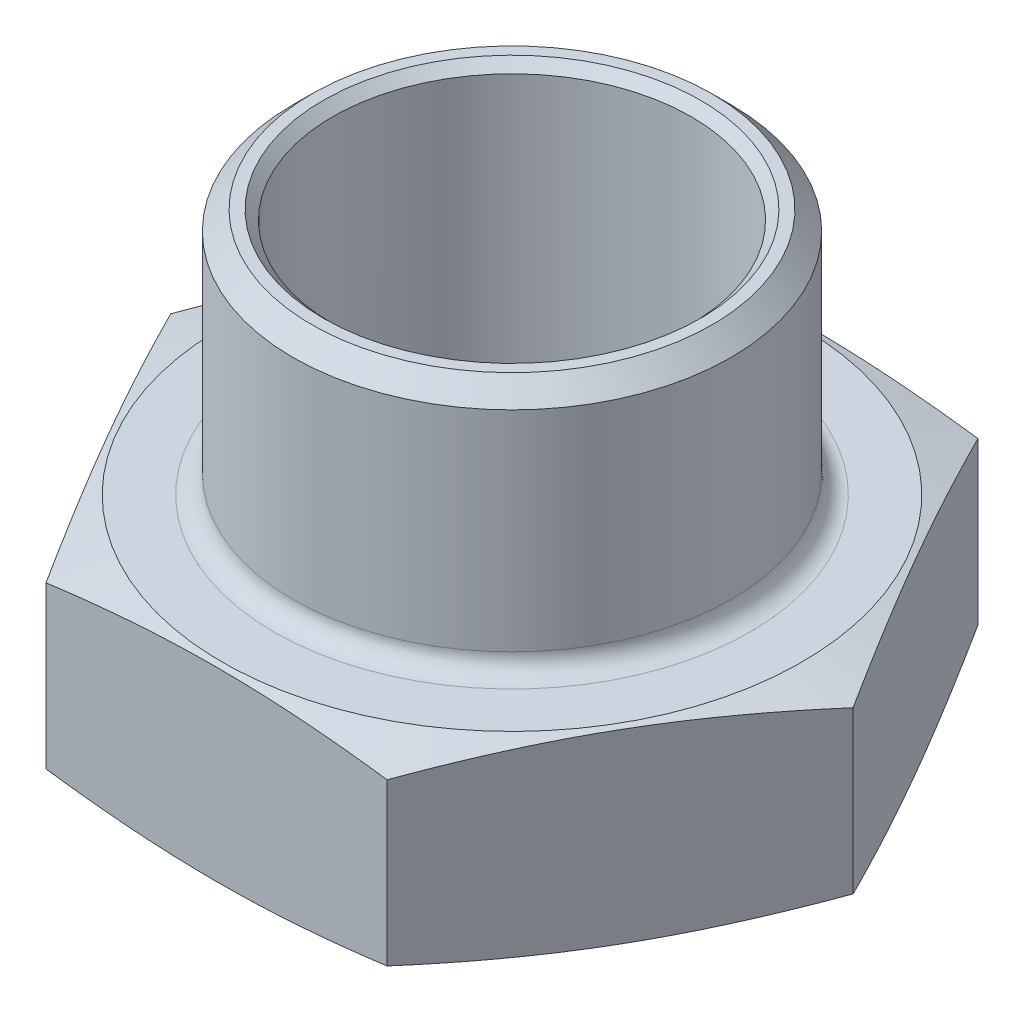
ISO-10303-21;
HEADER;
FILE_DESCRIPTION(('STEP AP214'),'2;1');
FILE_NAME('part.step','',(''),(''),'','','');
FILE_SCHEMA(('AUTOMOTIVE_DESIGN { 1 0 10303 214 1 1 1 1 }'));
ENDSEC;
DATA;
#1=APPLICATION_CONTEXT('core data for automotive mechanical design processes');
#2=APPLICATION_PROTOCOL_DEFINITION('international standard','automotive_design',2000,#1);
#3=PRODUCT_CONTEXT('',#1,'mechanical');
#4=PRODUCT('Part','Part','',(#3));
#5=PRODUCT_RELATED_PRODUCT_CATEGORY('part','',(#4));
#6=PRODUCT_DEFINITION_FORMATION('','',#4);
#7=PRODUCT_DEFINITION_CONTEXT('part definition',#1,'design');
#8=PRODUCT_DEFINITION('design','',#6,#7);
#9=PRODUCT_DEFINITION_SHAPE('','',#8);
#10=(LENGTH_UNIT() NAMED_UNIT(*) SI_UNIT(.MILLI.,.METRE.));
#11=(NAMED_UNIT(*) PLANE_ANGLE_UNIT() SI_UNIT($,.RADIAN.));
#12=(NAMED_UNIT(*) SI_UNIT($,.STERADIAN.) SOLID_ANGLE_UNIT());
#13=UNCERTAINTY_MEASURE_WITH_UNIT(LENGTH_MEASURE(1.E-05),#10,'distance_accuracy_value','');
#14=(GEOMETRIC_REPRESENTATION_CONTEXT(3) GLOBAL_UNCERTAINTY_ASSIGNED_CONTEXT((#13)) GLOBAL_UNIT_ASSIGNED_CONTEXT((#10,
#11,#12)) REPRESENTATION_CONTEXT('',''));
#15=CARTESIAN_POINT('',(0.,0.,0.));
#16=DIRECTION('',(0.,0.,1.));
#17=DIRECTION('',(1.,0.,0.));
#18=AXIS2_PLACEMENT_3D('',#15,#16,#17);
#19=CARTESIAN_POINT('',(43.6928822439766,28.4904169415951,36.0751899994845));
#20=DIRECTION('',(0.,1.,0.));
#21=DIRECTION('',(1.,0.,0.));
#22=AXIS2_PLACEMENT_3D('',#19,#20,#21);
#23=PLANE('',#22);
#24=CARTESIAN_POINT('',(47.9816722439766,28.4904169415951,31.7863999994844));
#25=DIRECTION('',(0.,1.,0.));
#26=DIRECTION('',(0.,0.,1.));
#27=AXIS2_PLACEMENT_3D('',#24,#25,#26);
#28=CIRCLE('',#27,3.2004);
#29=CARTESIAN_POINT('',(47.9816722439766,28.4904169415951,34.9867999994844));
#30=VERTEX_POINT('',#29);
#31=EDGE_CURVE('E38',#30,#30,#28,.T.);
#32=ORIENTED_EDGE('',*,*,#31,.F.);
#33=EDGE_LOOP('',(#32));
#34=FACE_BOUND('',#33,.T.);
#35=CARTESIAN_POINT('',(47.9816722439766,28.4904169415951,31.7863999994844));
#36=DIRECTION('',(0.,-1.,0.));
#37=DIRECTION('',(0.,0.,-1.));
#38=AXIS2_PLACEMENT_3D('',#35,#36,#37);
#39=CIRCLE('',#38,3.89889999999996);
#40=CARTESIAN_POINT('',(47.9816722439766,28.4904169415951,27.8874999994845));
#41=VERTEX_POINT('',#40);
#42=EDGE_CURVE('E279',#41,#41,#39,.T.);
#43=ORIENTED_EDGE('',*,*,#42,.F.);
#44=EDGE_LOOP('',(#43));
#45=FACE_BOUND('',#44,.T.);
#46=ADVANCED_FACE('F34',(#34,#45),#23,.T.);
#47=CARTESIAN_POINT('',(47.9816722439766,28.7444169415951,31.7863999994844));
#48=DIRECTION('',(0.,1.,0.));
#49=DIRECTION('',(0.,0.,1.));
#50=AXIS2_PLACEMENT_3D('',#47,#48,#49);
#51=TOROIDAL_SURFACE('',#50,3.20040000000002,0.254000000000013);
#52=CARTESIAN_POINT('',(47.9816722439766,28.7444169415951,31.7863999994844));
#53=DIRECTION('',(0.,1.,0.));
#54=DIRECTION('',(0.,0.,1.));
#55=AXIS2_PLACEMENT_3D('',#52,#53,#54);
#56=CIRCLE('',#55,2.9464);
#57=CARTESIAN_POINT('',(47.9816722439766,28.7444169415951,34.7327999994844));
#58=VERTEX_POINT('',#57);
#59=EDGE_CURVE('E105',#58,#58,#56,.T.);
#60=ORIENTED_EDGE('',*,*,#59,.F.);
#61=EDGE_LOOP('',(#60));
#62=FACE_BOUND('',#61,.T.);
#63=ORIENTED_EDGE('',*,*,#31,.T.);
#64=EDGE_LOOP('',(#63));
#65=FACE_BOUND('',#64,.T.);
#66=ADVANCED_FACE('F217',(#62,#65),#51,.F.);
#67=CARTESIAN_POINT('',(47.9816722439766,28.3052238277421,31.7863999994844));
#68=DIRECTION('',(0.,-1.,0.));
#69=DIRECTION('',(0.,0.,-1.));
#70=AXIS2_PLACEMENT_3D('',#67,#68,#69);
#71=CONICAL_SURFACE('',#70,4.59005011011132,1.30899693899576);
#72=ORIENTED_EDGE('',*,*,#42,.T.);
#73=EDGE_LOOP('',(#72));
#74=FACE_BOUND('',#73,.T.);
#75=CARTESIAN_POINT('',(45.6866471889209,28.3052238277421,27.8112999994845));
#76=CARTESIAN_POINT('',(45.591340552349,28.3307708291069,27.9763759363255));
#77=CARTESIAN_POINT('',(45.4958611245068,28.3539632130251,28.1417511564258));
#78=CARTESIAN_POINT('',(45.3045651064509,28.3947099623288,28.4730855789842));
#79=CARTESIAN_POINT('',(45.2087483952374,28.4122620381154,28.6390449910202));
#80=CARTESIAN_POINT('',(45.0173586926233,28.4407035763412,28.9705416799932));
#81=CARTESIAN_POINT('',(44.9217869951443,28.4516269534729,29.1360767157926));
#82=CARTESIAN_POINT('',(44.7305217341354,28.4662740755286,29.4673578655829));
#83=CARTESIAN_POINT('',(44.6348281977642,28.4699992131318,29.6331039325337));
#84=CARTESIAN_POINT('',(44.4434411250219,28.4699992131318,29.9645960664353));
#85=CARTESIAN_POINT('',(44.3477475886507,28.4662740755286,30.1303421333861));
#86=CARTESIAN_POINT('',(44.1564823276419,28.4516269534729,30.4616232831763));
#87=CARTESIAN_POINT('',(44.0609106301628,28.4407035763412,30.6271583189757));
#88=CARTESIAN_POINT('',(43.8695209275487,28.4122620381154,30.9586550079487));
#89=CARTESIAN_POINT('',(43.7737042163352,28.3947099623288,31.1246144199847));
#90=CARTESIAN_POINT('',(43.5824081982794,28.3539632130251,31.4559488425431));
#91=CARTESIAN_POINT('',(43.4869287704372,28.3307708291069,31.6213240626434));
#92=CARTESIAN_POINT('',(43.3916221338652,28.3052238277421,31.7863999994845));
#93=B_SPLINE_CURVE_WITH_KNOTS('',3,(#75,#76,#77,#78,#79,#80,#81,#82,#83,#84,#85,#86,#87,#88,#89,
#90,#91,#92),.UNSPECIFIED.,.F.,.F.,(4,2,2,2,2,2,2,2,4),(0.,0.576983100050313,1.15420012276933,
1.72843844362826,2.30256565261446,2.87669286160065,3.45093118245958,4.02814820517859,
4.60513130522891),.UNSPECIFIED.);
#94=CARTESIAN_POINT('',(45.6866471889209,28.3052238277421,27.8112999994845));
#95=VERTEX_POINT('',#94);
#96=CARTESIAN_POINT('',(43.3916221338652,28.3052238277421,31.7863999994844));
#97=VERTEX_POINT('',#96);
#98=EDGE_CURVE('E89',#95,#97,#93,.T.);
#99=ORIENTED_EDGE('',*,*,#98,.T.);
#100=CARTESIAN_POINT('',(43.3916221338652,28.3052238277421,31.7863999994844));
#101=CARTESIAN_POINT('',(43.4869287704372,28.3307708291069,31.9514759363255));
#102=CARTESIAN_POINT('',(43.5824081982794,28.3539632130251,32.1168511564258));
#103=CARTESIAN_POINT('',(43.7737042163352,28.3947099623288,32.4481855789842));
#104=CARTESIAN_POINT('',(43.8695209275488,28.4122620381154,32.6141449910202));
#105=CARTESIAN_POINT('',(44.0609106301628,28.4407035763412,32.9456416799932));
#106=CARTESIAN_POINT('',(44.1564823276419,28.4516269534729,33.1111767157926));
#107=CARTESIAN_POINT('',(44.3477475886507,28.4662740755286,33.4424578655828));
#108=CARTESIAN_POINT('',(44.4434411250219,28.4699992131318,33.6082039325336));
#109=CARTESIAN_POINT('',(44.6348281977642,28.4699992131318,33.9396960664353));
#110=CARTESIAN_POINT('',(44.7305217341354,28.4662740755286,34.1054421333861));
#111=CARTESIAN_POINT('',(44.9217869951443,28.4516269534729,34.4367232831763));
#112=CARTESIAN_POINT('',(45.0173586926233,28.4407035763412,34.6022583189757));
#113=CARTESIAN_POINT('',(45.2087483952374,28.4122620381154,34.9337550079487));
#114=CARTESIAN_POINT('',(45.3045651064509,28.3947099623288,35.0997144199847));
#115=CARTESIAN_POINT('',(45.4958611245068,28.3539632130251,35.4310488425431));
#116=CARTESIAN_POINT('',(45.591340552349,28.3307708291069,35.5964240626434));
#117=CARTESIAN_POINT('',(45.6866471889209,28.3052238277421,35.7614999994844));
#118=B_SPLINE_CURVE_WITH_KNOTS('',3,(#100,#101,#102,#103,#104,#105,#106,#107,#108,#109,#110,
#111,#112,#113,#114,#115,#116,#117),.UNSPECIFIED.,.F.,.F.,(4,2,2,2,2,2,2,2,4),(0.,
0.576983100050319,1.15420012276934,1.72843844362827,2.30256565261447,2.87669286160067,
3.45093118245959,4.02814820517861,4.60513130522892),.UNSPECIFIED.);
#119=CARTESIAN_POINT('',(45.6866471889209,28.3052238277421,35.7614999994844));
#120=VERTEX_POINT('',#119);
#121=EDGE_CURVE('E121',#97,#120,#118,.T.);
#122=ORIENTED_EDGE('',*,*,#121,.T.);
#123=CARTESIAN_POINT('',(45.6866471889209,28.3052238277421,35.7614999994844));
#124=CARTESIAN_POINT('',(45.8772604620647,28.3307708291069,35.7614999994844));
#125=CARTESIAN_POINT('',(46.0682193177492,28.3539632130251,35.7614999994844));
#126=CARTESIAN_POINT('',(46.4508113538609,28.3947099623288,35.7614999994844));
#127=CARTESIAN_POINT('',(46.6424447762879,28.4122620381154,35.7614999994844));
#128=CARTESIAN_POINT('',(47.025224181516,28.4407035763412,35.7614999994844));
#129=CARTESIAN_POINT('',(47.2163675764742,28.4516269534729,35.7614999994844));
#130=CARTESIAN_POINT('',(47.5988980984919,28.4662740755286,35.7614999994844));
#131=CARTESIAN_POINT('',(47.7902851712342,28.4699992131318,35.7614999994844));
#132=CARTESIAN_POINT('',(48.1730593167189,28.4699992131318,35.7614999994844));
#133=CARTESIAN_POINT('',(48.3644463894612,28.4662740755286,35.7614999994844));
#134=CARTESIAN_POINT('',(48.746976911479,28.4516269534729,35.7614999994844));
#135=CARTESIAN_POINT('',(48.9381203064371,28.4407035763412,35.7614999994844));
#136=CARTESIAN_POINT('',(49.3208997116652,28.4122620381154,35.7614999994844));
#137=CARTESIAN_POINT('',(49.5125331340922,28.3947099623288,35.7614999994844));
#138=CARTESIAN_POINT('',(49.895125170204,28.3539632130251,35.7614999994844));
#139=CARTESIAN_POINT('',(50.0860840258884,28.3307708291069,35.7614999994844));
#140=CARTESIAN_POINT('',(50.2766972990323,28.3052238277421,35.7614999994844));
#141=B_SPLINE_CURVE_WITH_KNOTS('',3,(#123,#124,#125,#126,#127,#128,#129,#130,#131,#132,#133,
#134,#135,#136,#137,#138,#139,#140),.UNSPECIFIED.,.F.,.F.,(4,2,2,2,2,2,2,2,4),(0.,
0.576983100050334,1.15420012276935,1.72843844362827,2.30256565261447,2.87669286160067,
3.4509311824596,4.02814820517861,4.60513130522893),.UNSPECIFIED.);
#142=CARTESIAN_POINT('',(50.2766972990323,28.3052238277421,35.7614999994844));
#143=VERTEX_POINT('',#142);
#144=EDGE_CURVE('E118',#120,#143,#141,.T.);
#145=ORIENTED_EDGE('',*,*,#144,.T.);
#146=CARTESIAN_POINT('',(50.2766972990323,28.3052238277421,35.7614999994844));
#147=CARTESIAN_POINT('',(50.3720039356042,28.3307708291069,35.5964240626434));
#148=CARTESIAN_POINT('',(50.4674833634464,28.3539632130251,35.4310488425431));
#149=CARTESIAN_POINT('',(50.6587793815023,28.3947099623288,35.0997144199847));
#150=CARTESIAN_POINT('',(50.7545960927158,28.4122620381154,34.9337550079487));
#151=CARTESIAN_POINT('',(50.9459857953298,28.4407035763412,34.6022583189757));
#152=CARTESIAN_POINT('',(51.0415574928089,28.4516269534729,34.4367232831763));
#153=CARTESIAN_POINT('',(51.2328227538178,28.4662740755286,34.105442133386));
#154=CARTESIAN_POINT('',(51.3285162901889,28.4699992131318,33.9396960664352));
#155=CARTESIAN_POINT('',(51.5199033629313,28.4699992131318,33.6082039325336));
#156=CARTESIAN_POINT('',(51.6155968993025,28.4662740755286,33.4424578655828));
#157=CARTESIAN_POINT('',(51.8068621603113,28.4516269534729,33.1111767157926));
#158=CARTESIAN_POINT('',(51.9024338577904,28.4407035763412,32.9456416799932));
#159=CARTESIAN_POINT('',(52.0938235604044,28.4122620381154,32.6141449910202));
#160=CARTESIAN_POINT('',(52.1896402716179,28.3947099623288,32.4481855789842));
#161=CARTESIAN_POINT('',(52.3809362896738,28.3539632130251,32.1168511564258));
#162=CARTESIAN_POINT('',(52.476415717516,28.3307708291069,31.9514759363255));
#163=CARTESIAN_POINT('',(52.571722354088,28.3052238277421,31.7863999994844));
#164=B_SPLINE_CURVE_WITH_KNOTS('',3,(#146,#147,#148,#149,#150,#151,#152,#153,#154,#155,#156,
#157,#158,#159,#160,#161,#162,#163),.UNSPECIFIED.,.F.,.F.,(4,2,2,2,2,2,2,2,4),(0.,
0.576983100050323,1.15420012276934,1.72843844362827,2.30256565261447,2.87669286160068,
3.4509311824596,4.02814820517862,4.60513130522893),.UNSPECIFIED.);
#165=CARTESIAN_POINT('',(52.571722354088,28.3052238277421,31.7863999994844));
#166=VERTEX_POINT('',#165);
#167=EDGE_CURVE('E115',#143,#166,#164,.T.);
#168=ORIENTED_EDGE('',*,*,#167,.T.);
#169=CARTESIAN_POINT('',(52.571722354088,28.3052238277421,31.7863999994844));
#170=CARTESIAN_POINT('',(52.476415717516,28.3307708291069,31.6213240626434));
#171=CARTESIAN_POINT('',(52.3809362896738,28.3539632130251,31.4559488425431));
#172=CARTESIAN_POINT('',(52.1896402716179,28.3947099623288,31.1246144199847));
#173=CARTESIAN_POINT('',(52.0938235604044,28.4122620381154,30.9586550079487));
#174=CARTESIAN_POINT('',(51.9024338577904,28.4407035763412,30.6271583189757));
#175=CARTESIAN_POINT('',(51.8068621603113,28.4516269534729,30.4616232831763));
#176=CARTESIAN_POINT('',(51.6155968993024,28.4662740755286,30.1303421333861));
#177=CARTESIAN_POINT('',(51.5199033629313,28.4699992131318,29.9645960664353));
#178=CARTESIAN_POINT('',(51.3285162901889,28.4699992131318,29.6331039325337));
#179=CARTESIAN_POINT('',(51.2328227538178,28.4662740755286,29.4673578655828));
#180=CARTESIAN_POINT('',(51.0415574928089,28.4516269534729,29.1360767157926));
#181=CARTESIAN_POINT('',(50.9459857953298,28.4407035763412,28.9705416799932));
#182=CARTESIAN_POINT('',(50.7545960927158,28.4122620381154,28.6390449910202));
#183=CARTESIAN_POINT('',(50.6587793815023,28.3947099623288,28.4730855789842));
#184=CARTESIAN_POINT('',(50.4674833634464,28.3539632130251,28.1417511564258));
#185=CARTESIAN_POINT('',(50.3720039356042,28.3307708291069,27.9763759363255));
#186=CARTESIAN_POINT('',(50.2766972990323,28.3052238277421,27.8112999994845));
#187=B_SPLINE_CURVE_WITH_KNOTS('',3,(#169,#170,#171,#172,#173,#174,#175,#176,#177,#178,#179,
#180,#181,#182,#183,#184,#185,#186),.UNSPECIFIED.,.F.,.F.,(4,2,2,2,2,2,2,2,4),(0.,
0.576983100050323,1.15420012276934,1.72843844362826,2.30256565261446,2.87669286160066,
3.45093118245958,4.02814820517859,4.60513130522892),.UNSPECIFIED.);
#188=CARTESIAN_POINT('',(50.2766972990323,28.3052238277421,27.8112999994845));
#189=VERTEX_POINT('',#188);
#190=EDGE_CURVE('E92',#166,#189,#187,.T.);
#191=ORIENTED_EDGE('',*,*,#190,.T.);
#192=CARTESIAN_POINT('',(50.2766972990323,28.3052238277421,27.8112999994845));
#193=CARTESIAN_POINT('',(50.0860840258884,28.3307708291069,27.8112999994845));
#194=CARTESIAN_POINT('',(49.895125170204,28.3539632130251,27.8112999994845));
#195=CARTESIAN_POINT('',(49.5125331340923,28.3947099623288,27.8112999994845));
#196=CARTESIAN_POINT('',(49.3208997116652,28.4122620381154,27.8112999994845));
#197=CARTESIAN_POINT('',(48.9381203064371,28.4407035763412,27.8112999994845));
#198=CARTESIAN_POINT('',(48.746976911479,28.4516269534729,27.8112999994845));
#199=CARTESIAN_POINT('',(48.3644463894613,28.4662740755286,27.8112999994845));
#200=CARTESIAN_POINT('',(48.1730593167189,28.4699992131318,27.8112999994845));
#201=CARTESIAN_POINT('',(47.7902851712343,28.4699992131318,27.8112999994845));
#202=CARTESIAN_POINT('',(47.5988980984919,28.4662740755286,27.8112999994845));
#203=CARTESIAN_POINT('',(47.2163675764742,28.4516269534729,27.8112999994845));
#204=CARTESIAN_POINT('',(47.025224181516,28.4407035763412,27.8112999994845));
#205=CARTESIAN_POINT('',(46.642444776288,28.4122620381154,27.8112999994845));
#206=CARTESIAN_POINT('',(46.4508113538609,28.3947099623288,27.8112999994845));
#207=CARTESIAN_POINT('',(46.0682193177492,28.3539632130251,27.8112999994845));
#208=CARTESIAN_POINT('',(45.8772604620647,28.3307708291069,27.8112999994845));
#209=CARTESIAN_POINT('',(45.6866471889209,28.3052238277421,27.8112999994845));
#210=B_SPLINE_CURVE_WITH_KNOTS('',3,(#192,#193,#194,#195,#196,#197,#198,#199,#200,#201,#202,
#203,#204,#205,#206,#207,#208,#209),.UNSPECIFIED.,.F.,.F.,(4,2,2,2,2,2,2,2,4),(0.,
0.57698310005032,1.15420012276933,1.72843844362826,2.30256565261446,2.87669286160066,
3.45093118245958,4.02814820517861,4.60513130522894),.UNSPECIFIED.);
#211=EDGE_CURVE('E86',#189,#95,#210,.T.);
#212=ORIENTED_EDGE('',*,*,#211,.T.);
#213=EDGE_LOOP('',(#99,#122,#145,#168,#191,#212));
#214=FACE_BOUND('',#213,.T.);
#215=ADVANCED_FACE('F88',(#74,#214),#71,.T.);
#216=CARTESIAN_POINT('',(47.9816722439766,28.7444169415951,31.7863999994844));
#217=DIRECTION('',(0.,1.,0.));
#218=DIRECTION('',(0.,0.,1.));
#219=AXIS2_PLACEMENT_3D('',#216,#217,#218);
#220=CYLINDRICAL_SURFACE('',#219,2.9464);
#221=CARTESIAN_POINT('',(47.9816722439766,31.5638169415951,31.7863999994844));
#222=DIRECTION('',(0.,1.,0.));
#223=DIRECTION('',(0.,0.,1.));
#224=AXIS2_PLACEMENT_3D('',#221,#222,#223);
#225=CIRCLE('',#224,2.9464);
#226=CARTESIAN_POINT('',(47.9816722439766,31.5638169415951,34.7327999994844));
#227=VERTEX_POINT('',#226);
#228=EDGE_CURVE('E123',#227,#227,#225,.T.);
#229=ORIENTED_EDGE('',*,*,#228,.F.);
#230=EDGE_LOOP('',(#229));
#231=FACE_BOUND('',#230,.T.);
#232=ORIENTED_EDGE('',*,*,#59,.T.);
#233=EDGE_LOOP('',(#232));
#234=FACE_BOUND('',#233,.T.);
#235=ADVANCED_FACE('F216',(#231,#234),#220,.T.);
#236=CARTESIAN_POINT('',(45.6866471889209,28.4904169415951,27.8112999994845));
#237=DIRECTION('',(0.866025403784439,0.,0.499999999999999));
#238=DIRECTION('',(-0.499999999999999,0.,0.866025403784439));
#239=AXIS2_PLACEMENT_3D('',#236,#237,#238);
#240=PLANE('',#239);
#241=CARTESIAN_POINT('',(43.3916221338652,26.1356100554481,31.7863999994844));
#242=CARTESIAN_POINT('',(43.4869287704372,26.1100630540833,31.6213240626434));
#243=CARTESIAN_POINT('',(43.5824081982794,26.0868706701651,31.4559488425431));
#244=CARTESIAN_POINT('',(43.7737042163352,26.0461239208614,31.1246144199847));
#245=CARTESIAN_POINT('',(43.8695209275487,26.0285718450747,30.9586550079487));
#246=CARTESIAN_POINT('',(44.0609106301628,26.0001303068489,30.6271583189757));
#247=CARTESIAN_POINT('',(44.1564823276419,25.9892069297173,30.4616232831763));
#248=CARTESIAN_POINT('',(44.3477475886507,25.9745598076616,30.1303421333861));
#249=CARTESIAN_POINT('',(44.4434411250219,25.9708346700583,29.9645960664353));
#250=CARTESIAN_POINT('',(44.6348281977642,25.9708346700583,29.6331039325337));
#251=CARTESIAN_POINT('',(44.7305217341354,25.9745598076616,29.4673578655829));
#252=CARTESIAN_POINT('',(44.9217869951443,25.9892069297173,29.1360767157926));
#253=CARTESIAN_POINT('',(45.0173586926233,26.0001303068489,28.9705416799932));
#254=CARTESIAN_POINT('',(45.2087483952374,26.0285718450747,28.6390449910202));
#255=CARTESIAN_POINT('',(45.3045651064509,26.0461239208614,28.4730855789842));
#256=CARTESIAN_POINT('',(45.4958611245068,26.0868706701651,28.1417511564259));
#257=CARTESIAN_POINT('',(45.591340552349,26.1100630540833,27.9763759363255));
#258=CARTESIAN_POINT('',(45.6866471889209,26.1356100554481,27.8112999994845));
#259=B_SPLINE_CURVE_WITH_KNOTS('',3,(#241,#242,#243,#244,#245,#246,#247,#248,#249,#250,#251,
#252,#253,#254,#255,#256,#257,#258),.UNSPECIFIED.,.F.,.F.,(4,2,2,2,2,2,2,2,4),(0.,
0.576983100050321,1.15420012276933,1.72843844362826,2.30256565261445,2.87669286160065,
3.45093118245956,4.02814820517858,4.6051313052289),.UNSPECIFIED.);
#260=CARTESIAN_POINT('',(43.3916221338652,26.1356100554481,31.7863999994844));
#261=VERTEX_POINT('',#260);
#262=CARTESIAN_POINT('',(45.6866471889209,26.1356100554481,27.8112999994845));
#263=VERTEX_POINT('',#262);
#264=EDGE_CURVE('E126',#261,#263,#259,.T.);
#265=ORIENTED_EDGE('',*,*,#264,.F.);
#266=DIRECTION('',(0.,1.,0.));
#267=VECTOR('',#266,1.);
#268=CARTESIAN_POINT('',(43.3916221338652,27.146406185094,31.7863999994844));
#269=LINE('',#268,#267);
#270=EDGE_CURVE('E103',#261,#97,#269,.T.);
#271=ORIENTED_EDGE('',*,*,#270,.T.);
#272=ORIENTED_EDGE('',*,*,#98,.F.);
#273=DIRECTION('',(0.,-1.,0.));
#274=VECTOR('',#273,1.);
#275=CARTESIAN_POINT('',(45.6866471889209,27.146406185094,27.8112999994845));
#276=LINE('',#275,#274);
#277=EDGE_CURVE('E96',#95,#263,#276,.T.);
#278=ORIENTED_EDGE('',*,*,#277,.T.);
#279=EDGE_LOOP('',(#265,#271,#272,#278));
#280=FACE_BOUND('',#279,.T.);
#281=ADVANCED_FACE('F100',(#280),#240,.F.);
#282=CARTESIAN_POINT('',(50.2766972990323,28.4904169415951,27.8112999994845));
#283=DIRECTION('',(0.,0.,1.));
#284=DIRECTION('',(-1.,0.,0.));
#285=AXIS2_PLACEMENT_3D('',#282,#283,#284);
#286=PLANE('',#285);
#287=DIRECTION('',(0.,-1.,0.));
#288=VECTOR('',#287,1.);
#289=CARTESIAN_POINT('',(50.2766972990323,27.146406185094,27.8112999994845));
#290=LINE('',#289,#288);
#291=CARTESIAN_POINT('',(50.2766972990323,26.1356100554481,27.8112999994845));
#292=VERTEX_POINT('',#291);
#293=EDGE_CURVE('E113',#189,#292,#290,.T.);
#294=ORIENTED_EDGE('',*,*,#293,.T.);
#295=CARTESIAN_POINT('',(45.6866471889209,26.1356100554481,27.8112999994845));
#296=CARTESIAN_POINT('',(45.8772604620647,26.1100630540833,27.8112999994845));
#297=CARTESIAN_POINT('',(46.0682193177492,26.0868706701651,27.8112999994845));
#298=CARTESIAN_POINT('',(46.4508113538609,26.0461239208614,27.8112999994845));
#299=CARTESIAN_POINT('',(46.6424447762879,26.0285718450747,27.8112999994845));
#300=CARTESIAN_POINT('',(47.025224181516,26.0001303068489,27.8112999994845));
#301=CARTESIAN_POINT('',(47.2163675764742,25.9892069297172,27.8112999994845));
#302=CARTESIAN_POINT('',(47.5988980984919,25.9745598076616,27.8112999994845));
#303=CARTESIAN_POINT('',(47.7902851712343,25.9708346700583,27.8112999994845));
#304=CARTESIAN_POINT('',(48.1730593167189,25.9708346700583,27.8112999994845));
#305=CARTESIAN_POINT('',(48.3644463894613,25.9745598076616,27.8112999994845));
#306=CARTESIAN_POINT('',(48.746976911479,25.9892069297172,27.8112999994845));
#307=CARTESIAN_POINT('',(48.9381203064371,26.0001303068489,27.8112999994845));
#308=CARTESIAN_POINT('',(49.3208997116652,26.0285718450747,27.8112999994845));
#309=CARTESIAN_POINT('',(49.5125331340923,26.0461239208614,27.8112999994845));
#310=CARTESIAN_POINT('',(49.895125170204,26.0868706701651,27.8112999994845));
#311=CARTESIAN_POINT('',(50.0860840258884,26.1100630540833,27.8112999994845));
#312=CARTESIAN_POINT('',(50.2766972990323,26.1356100554481,27.8112999994845));
#313=B_SPLINE_CURVE_WITH_KNOTS('',3,(#295,#296,#297,#298,#299,#300,#301,#302,#303,#304,#305,
#306,#307,#308,#309,#310,#311,#312),.UNSPECIFIED.,.F.,.F.,(4,2,2,2,2,2,2,2,4),(0.,
0.576983100050335,1.15420012276935,1.72843844362828,2.30256565261449,2.87669286160069,
3.45093118245961,4.02814820517863,4.60513130522894),.UNSPECIFIED.);
#314=EDGE_CURVE('E109',#263,#292,#313,.T.);
#315=ORIENTED_EDGE('',*,*,#314,.F.);
#316=ORIENTED_EDGE('',*,*,#277,.F.);
#317=ORIENTED_EDGE('',*,*,#211,.F.);
#318=EDGE_LOOP('',(#294,#315,#316,#317));
#319=FACE_BOUND('',#318,.T.);
#320=ADVANCED_FACE('F107',(#319),#286,.F.);
#321=CARTESIAN_POINT('',(52.571722354088,28.4904169415951,31.7863999994844));
#322=DIRECTION('',(-0.866025403784437,0.,0.500000000000003));
#323=DIRECTION('',(-0.500000000000003,0.,-0.866025403784437));
#324=AXIS2_PLACEMENT_3D('',#321,#322,#323);
#325=PLANE('',#324);
#326=CARTESIAN_POINT('',(50.2766972990323,26.1356100554481,27.8112999994845));
#327=CARTESIAN_POINT('',(50.3720039356042,26.1100630540833,27.9763759363255));
#328=CARTESIAN_POINT('',(50.4674833634464,26.0868706701651,28.1417511564258));
#329=CARTESIAN_POINT('',(50.6587793815023,26.0461239208614,28.4730855789842));
#330=CARTESIAN_POINT('',(50.7545960927158,26.0285718450747,28.6390449910202));
#331=CARTESIAN_POINT('',(50.9459857953298,26.0001303068489,28.9705416799932));
#332=CARTESIAN_POINT('',(51.0415574928089,25.9892069297173,29.1360767157926));
#333=CARTESIAN_POINT('',(51.2328227538178,25.9745598076616,29.4673578655828));
#334=CARTESIAN_POINT('',(51.3285162901889,25.9708346700583,29.6331039325337));
#335=CARTESIAN_POINT('',(51.5199033629313,25.9708346700583,29.9645960664353));
#336=CARTESIAN_POINT('',(51.6155968993024,25.9745598076616,30.1303421333861));
#337=CARTESIAN_POINT('',(51.8068621603113,25.9892069297173,30.4616232831763));
#338=CARTESIAN_POINT('',(51.9024338577904,26.0001303068489,30.6271583189757));
#339=CARTESIAN_POINT('',(52.0938235604044,26.0285718450747,30.9586550079487));
#340=CARTESIAN_POINT('',(52.1896402716179,26.0461239208614,31.1246144199847));
#341=CARTESIAN_POINT('',(52.3809362896738,26.0868706701651,31.4559488425431));
#342=CARTESIAN_POINT('',(52.476415717516,26.1100630540833,31.6213240626434));
#343=CARTESIAN_POINT('',(52.571722354088,26.1356100554481,31.7863999994845));
#344=B_SPLINE_CURVE_WITH_KNOTS('',3,(#326,#327,#328,#329,#330,#331,#332,#333,#334,#335,#336,
#337,#338,#339,#340,#341,#342,#343),.UNSPECIFIED.,.F.,.F.,(4,2,2,2,2,2,2,2,4),(0.,
0.576983100050324,1.15420012276934,1.72843844362826,2.30256565261446,2.87669286160066,
3.45093118245958,4.0281482051786,4.60513130522893),.UNSPECIFIED.);
#345=CARTESIAN_POINT('',(52.571722354088,26.1356100554481,31.7863999994844));
#346=VERTEX_POINT('',#345);
#347=EDGE_CURVE('E179',#292,#346,#344,.T.);
#348=ORIENTED_EDGE('',*,*,#347,.F.);
#349=ORIENTED_EDGE('',*,*,#293,.F.);
#350=ORIENTED_EDGE('',*,*,#190,.F.);
#351=DIRECTION('',(0.,-1.,0.));
#352=VECTOR('',#351,1.);
#353=CARTESIAN_POINT('',(52.571722354088,27.146406185094,31.7863999994844));
#354=LINE('',#353,#352);
#355=EDGE_CURVE('E116',#166,#346,#354,.T.);
#356=ORIENTED_EDGE('',*,*,#355,.T.);
#357=EDGE_LOOP('',(#348,#349,#350,#356));
#358=FACE_BOUND('',#357,.T.);
#359=ADVANCED_FACE('F196',(#358),#325,.F.);
#360=CARTESIAN_POINT('',(50.2766972990323,28.4904169415951,35.7614999994844));
#361=DIRECTION('',(-0.866025403784438,0.,-0.500000000000002));
#362=DIRECTION('',(0.500000000000002,0.,-0.866025403784438));
#363=AXIS2_PLACEMENT_3D('',#360,#361,#362);
#364=PLANE('',#363);
#365=CARTESIAN_POINT('',(52.571722354088,26.1356100554481,31.7863999994844));
#366=CARTESIAN_POINT('',(52.476415717516,26.1100630540833,31.9514759363255));
#367=CARTESIAN_POINT('',(52.3809362896738,26.0868706701651,32.1168511564258));
#368=CARTESIAN_POINT('',(52.1896402716179,26.0461239208614,32.4481855789842));
#369=CARTESIAN_POINT('',(52.0938235604044,26.0285718450747,32.6141449910202));
#370=CARTESIAN_POINT('',(51.9024338577904,26.0001303068489,32.9456416799932));
#371=CARTESIAN_POINT('',(51.8068621603113,25.9892069297173,33.1111767157926));
#372=CARTESIAN_POINT('',(51.6155968993025,25.9745598076616,33.4424578655828));
#373=CARTESIAN_POINT('',(51.5199033629313,25.9708346700584,33.6082039325336));
#374=CARTESIAN_POINT('',(51.3285162901889,25.9708346700584,33.9396960664353));
#375=CARTESIAN_POINT('',(51.2328227538178,25.9745598076616,34.1054421333861));
#376=CARTESIAN_POINT('',(51.0415574928089,25.9892069297173,34.4367232831763));
#377=CARTESIAN_POINT('',(50.9459857953298,26.0001303068489,34.6022583189757));
#378=CARTESIAN_POINT('',(50.7545960927158,26.0285718450748,34.9337550079487));
#379=CARTESIAN_POINT('',(50.6587793815023,26.0461239208614,35.0997144199847));
#380=CARTESIAN_POINT('',(50.4674833634464,26.0868706701651,35.4310488425431));
#381=CARTESIAN_POINT('',(50.3720039356042,26.1100630540833,35.5964240626434));
#382=CARTESIAN_POINT('',(50.2766972990323,26.1356100554481,35.7614999994844));
#383=B_SPLINE_CURVE_WITH_KNOTS('',3,(#365,#366,#367,#368,#369,#370,#371,#372,#373,#374,#375,
#376,#377,#378,#379,#380,#381,#382),.UNSPECIFIED.,.F.,.F.,(4,2,2,2,2,2,2,2,4),(0.,
0.576983100050324,1.15420012276935,1.72843844362827,2.30256565261447,2.87669286160067,
3.4509311824596,4.02814820517862,4.60513130522894),.UNSPECIFIED.);
#384=CARTESIAN_POINT('',(50.2766972990323,26.1356100554481,35.7614999994844));
#385=VERTEX_POINT('',#384);
#386=EDGE_CURVE('E173',#346,#385,#383,.T.);
#387=ORIENTED_EDGE('',*,*,#386,.F.);
#388=ORIENTED_EDGE('',*,*,#355,.F.);
#389=ORIENTED_EDGE('',*,*,#167,.F.);
#390=DIRECTION('',(0.,-1.,0.));
#391=VECTOR('',#390,1.);
#392=CARTESIAN_POINT('',(50.2766972990323,27.146406185094,35.7614999994844));
#393=LINE('',#392,#391);
#394=EDGE_CURVE('E119',#143,#385,#393,.T.);
#395=ORIENTED_EDGE('',*,*,#394,.T.);
#396=EDGE_LOOP('',(#387,#388,#389,#395));
#397=FACE_BOUND('',#396,.T.);
#398=ADVANCED_FACE('F235',(#397),#364,.F.);
#399=CARTESIAN_POINT('',(45.6866471889209,28.4904169415951,35.7614999994844));
#400=DIRECTION('',(0.,0.,-1.));
#401=DIRECTION('',(1.,0.,0.));
#402=AXIS2_PLACEMENT_3D('',#399,#400,#401);
#403=PLANE('',#402);
#404=CARTESIAN_POINT('',(50.2766972990323,26.1356100554481,35.7614999994844));
#405=CARTESIAN_POINT('',(50.0860840258884,26.1100630540833,35.7614999994844));
#406=CARTESIAN_POINT('',(49.895125170204,26.0868706701651,35.7614999994844));
#407=CARTESIAN_POINT('',(49.5125331340922,26.0461239208614,35.7614999994844));
#408=CARTESIAN_POINT('',(49.3208997116652,26.0285718450748,35.7614999994844));
#409=CARTESIAN_POINT('',(48.9381203064371,26.0001303068489,35.7614999994844));
#410=CARTESIAN_POINT('',(48.746976911479,25.9892069297173,35.7614999994844));
#411=CARTESIAN_POINT('',(48.3644463894612,25.9745598076616,35.7614999994844));
#412=CARTESIAN_POINT('',(48.1730593167189,25.9708346700584,35.7614999994844));
#413=CARTESIAN_POINT('',(47.7902851712342,25.9708346700584,35.7614999994844));
#414=CARTESIAN_POINT('',(47.5988980984919,25.9745598076616,35.7614999994844));
#415=CARTESIAN_POINT('',(47.2163675764742,25.9892069297173,35.7614999994844));
#416=CARTESIAN_POINT('',(47.025224181516,26.0001303068489,35.7614999994844));
#417=CARTESIAN_POINT('',(46.6424447762879,26.0285718450748,35.7614999994844));
#418=CARTESIAN_POINT('',(46.4508113538609,26.0461239208614,35.7614999994844));
#419=CARTESIAN_POINT('',(46.0682193177492,26.0868706701651,35.7614999994844));
#420=CARTESIAN_POINT('',(45.8772604620648,26.1100630540833,35.7614999994844));
#421=CARTESIAN_POINT('',(45.6866471889209,26.1356100554481,35.7614999994844));
#422=B_SPLINE_CURVE_WITH_KNOTS('',3,(#404,#405,#406,#407,#408,#409,#410,#411,#412,#413,#414,
#415,#416,#417,#418,#419,#420,#421),.UNSPECIFIED.,.F.,.F.,(4,2,2,2,2,2,2,2,4),(0.,
0.576983100050328,1.15420012276934,1.72843844362826,2.30256565261447,2.87669286160067,
3.45093118245958,4.0281482051786,4.60513130522892),.UNSPECIFIED.);
#423=CARTESIAN_POINT('',(45.6866471889209,26.1356100554481,35.7614999994844));
#424=VERTEX_POINT('',#423);
#425=EDGE_CURVE('E150',#385,#424,#422,.T.);
#426=ORIENTED_EDGE('',*,*,#425,.F.);
#427=ORIENTED_EDGE('',*,*,#394,.F.);
#428=ORIENTED_EDGE('',*,*,#144,.F.);
#429=DIRECTION('',(0.,-1.,0.));
#430=VECTOR('',#429,1.);
#431=CARTESIAN_POINT('',(45.6866471889209,27.146406185094,35.7614999994844));
#432=LINE('',#431,#430);
#433=EDGE_CURVE('E53',#120,#424,#432,.T.);
#434=ORIENTED_EDGE('',*,*,#433,.T.);
#435=EDGE_LOOP('',(#426,#427,#428,#434));
#436=FACE_BOUND('',#435,.T.);
#437=ADVANCED_FACE('F238',(#436),#403,.F.);
#438=CARTESIAN_POINT('',(43.3916221338652,28.4904169415951,31.7863999994844));
#439=DIRECTION('',(0.86602540378444,0.,-0.499999999999998));
#440=DIRECTION('',(0.499999999999998,0.,0.86602540378444));
#441=AXIS2_PLACEMENT_3D('',#438,#439,#440);
#442=PLANE('',#441);
#443=CARTESIAN_POINT('',(45.6866471889209,26.1356100554481,35.7614999994844));
#444=CARTESIAN_POINT('',(45.591340552349,26.1100630540833,35.5964240626434));
#445=CARTESIAN_POINT('',(45.4958611245068,26.0868706701651,35.4310488425431));
#446=CARTESIAN_POINT('',(45.3045651064509,26.0461239208614,35.0997144199847));
#447=CARTESIAN_POINT('',(45.2087483952374,26.0285718450748,34.9337550079487));
#448=CARTESIAN_POINT('',(45.0173586926233,26.000130306849,34.6022583189757));
#449=CARTESIAN_POINT('',(44.9217869951442,25.9892069297173,34.4367232831763));
#450=CARTESIAN_POINT('',(44.7305217341354,25.9745598076616,34.105442133386));
#451=CARTESIAN_POINT('',(44.6348281977642,25.9708346700584,33.9396960664352));
#452=CARTESIAN_POINT('',(44.4434411250219,25.9708346700584,33.6082039325336));
#453=CARTESIAN_POINT('',(44.3477475886507,25.9745598076616,33.4424578655828));
#454=CARTESIAN_POINT('',(44.1564823276419,25.9892069297173,33.1111767157926));
#455=CARTESIAN_POINT('',(44.0609106301628,26.0001303068489,32.9456416799932));
#456=CARTESIAN_POINT('',(43.8695209275487,26.0285718450748,32.6141449910202));
#457=CARTESIAN_POINT('',(43.7737042163352,26.0461239208614,32.4481855789842));
#458=CARTESIAN_POINT('',(43.5824081982793,26.0868706701651,32.1168511564258));
#459=CARTESIAN_POINT('',(43.4869287704371,26.1100630540833,31.9514759363255));
#460=CARTESIAN_POINT('',(43.3916221338652,26.1356100554481,31.7863999994844));
#461=B_SPLINE_CURVE_WITH_KNOTS('',3,(#443,#444,#445,#446,#447,#448,#449,#450,#451,#452,#453,
#454,#455,#456,#457,#458,#459,#460),.UNSPECIFIED.,.F.,.F.,(4,2,2,2,2,2,2,2,4),(0.,
0.576983100050321,1.15420012276934,1.72843844362827,2.30256565261447,2.87669286160067,
3.45093118245959,4.02814820517861,4.60513130522892),.UNSPECIFIED.);
#462=EDGE_CURVE('E142',#424,#261,#461,.T.);
#463=ORIENTED_EDGE('',*,*,#462,.F.);
#464=ORIENTED_EDGE('',*,*,#433,.F.);
#465=ORIENTED_EDGE('',*,*,#121,.F.);
#466=ORIENTED_EDGE('',*,*,#270,.F.);
#467=EDGE_LOOP('',(#463,#464,#465,#466));
#468=FACE_BOUND('',#467,.T.);
#469=ADVANCED_FACE('F156',(#468),#442,.F.);
#470=CARTESIAN_POINT('',(47.9816722439766,31.5638169415951,31.7863999994844));
#471=DIRECTION('',(0.,-1.,0.));
#472=DIRECTION('',(0.,0.,-1.));
#473=AXIS2_PLACEMENT_3D('',#470,#471,#472);
#474=CONICAL_SURFACE('',#473,2.9464,0.785398163397442);
#475=CARTESIAN_POINT('',(47.9816722439766,31.8178169415951,31.7863999994844));
#476=DIRECTION('',(0.,-1.,0.));
#477=DIRECTION('',(0.,0.,-1.));
#478=AXIS2_PLACEMENT_3D('',#475,#476,#477);
#479=CIRCLE('',#478,2.6924);
#480=CARTESIAN_POINT('',(47.9816722439766,31.8178169415951,29.0939999994844));
#481=VERTEX_POINT('',#480);
#482=EDGE_CURVE('E139',#481,#481,#479,.F.);
#483=ORIENTED_EDGE('',*,*,#482,.F.);
#484=EDGE_LOOP('',(#483));
#485=FACE_BOUND('',#484,.T.);
#486=ORIENTED_EDGE('',*,*,#228,.T.);
#487=EDGE_LOOP('',(#486));
#488=FACE_BOUND('',#487,.T.);
#489=ADVANCED_FACE('F164',(#485,#488),#474,.T.);
#490=CARTESIAN_POINT('',(47.9816722439766,25.9504169415951,31.7863999994844));
#491=DIRECTION('',(0.,1.,0.));
#492=DIRECTION('',(0.,0.,1.));
#493=AXIS2_PLACEMENT_3D('',#490,#491,#492);
#494=CONICAL_SURFACE('',#493,3.89889999999996,1.30899693899573);
#495=CARTESIAN_POINT('',(47.9816722439766,25.9504169415951,31.7863999994844));
#496=DIRECTION('',(0.,1.,0.));
#497=DIRECTION('',(0.,0.,1.));
#498=AXIS2_PLACEMENT_3D('',#495,#496,#497);
#499=CIRCLE('',#498,3.89889999999996);
#500=CARTESIAN_POINT('',(47.9816722439766,25.9504169415951,35.6852999994844));
#501=VERTEX_POINT('',#500);
#502=EDGE_CURVE('E136',#501,#501,#499,.F.);
#503=ORIENTED_EDGE('',*,*,#502,.F.);
#504=EDGE_LOOP('',(#503));
#505=FACE_BOUND('',#504,.T.);
#506=ORIENTED_EDGE('',*,*,#425,.T.);
#507=ORIENTED_EDGE('',*,*,#462,.T.);
#508=ORIENTED_EDGE('',*,*,#264,.T.);
#509=ORIENTED_EDGE('',*,*,#314,.T.);
#510=ORIENTED_EDGE('',*,*,#347,.T.);
#511=ORIENTED_EDGE('',*,*,#386,.T.);
#512=EDGE_LOOP('',(#506,#507,#508,#509,#510,#511));
#513=FACE_BOUND('',#512,.T.);
#514=ADVANCED_FACE('F159',(#505,#513),#494,.T.);
#515=CARTESIAN_POINT('',(45.0200322439766,31.8178169415951,34.7480399994844));
#516=DIRECTION('',(0.,1.,0.));
#517=DIRECTION('',(1.,0.,0.));
#518=AXIS2_PLACEMENT_3D('',#515,#516,#517);
#519=PLANE('',#518);
#520=CARTESIAN_POINT('',(47.9816722439766,31.8178169415951,31.7863999994844));
#521=DIRECTION('',(0.,1.,0.));
#522=DIRECTION('',(0.,0.,1.));
#523=AXIS2_PLACEMENT_3D('',#520,#521,#522);
#524=CIRCLE('',#523,2.53999999999996);
#525=CARTESIAN_POINT('',(47.9816722439766,31.8178169415951,34.3263999994844));
#526=VERTEX_POINT('',#525);
#527=EDGE_CURVE('E133',#526,#526,#524,.T.);
#528=ORIENTED_EDGE('',*,*,#527,.F.);
#529=EDGE_LOOP('',(#528));
#530=FACE_BOUND('',#529,.T.);
#531=ORIENTED_EDGE('',*,*,#482,.T.);
#532=EDGE_LOOP('',(#531));
#533=FACE_BOUND('',#532,.T.);
#534=ADVANCED_FACE('F163',(#530,#533),#519,.T.);
#535=CARTESIAN_POINT('',(43.6928822439766,25.9504169415951,27.4976099994844));
#536=DIRECTION('',(0.,-1.,0.));
#537=DIRECTION('',(1.,0.,0.));
#538=AXIS2_PLACEMENT_3D('',#535,#536,#537);
#539=PLANE('',#538);
#540=CARTESIAN_POINT('',(47.9816722439766,25.9504169415951,31.7863999994844));
#541=DIRECTION('',(0.,-1.,0.));
#542=DIRECTION('',(0.,0.,-1.));
#543=AXIS2_PLACEMENT_3D('',#540,#541,#542);
#544=CIRCLE('',#543,2.54000000000086);
#545=CARTESIAN_POINT('',(47.9816722439766,25.9504169415951,29.2463999994836));
#546=VERTEX_POINT('',#545);
#547=EDGE_CURVE('E130',#546,#546,#544,.T.);
#548=ORIENTED_EDGE('',*,*,#547,.F.);
#549=EDGE_LOOP('',(#548));
#550=FACE_BOUND('',#549,.T.);
#551=ORIENTED_EDGE('',*,*,#502,.T.);
#552=EDGE_LOOP('',(#551));
#553=FACE_BOUND('',#552,.T.);
#554=ADVANCED_FACE('F262',(#550,#553),#539,.T.);
#555=CARTESIAN_POINT('',(47.9816722439766,31.8178169415951,31.7863999994844));
#556=DIRECTION('',(0.,1.,0.));
#557=DIRECTION('',(0.,0.,1.));
#558=AXIS2_PLACEMENT_3D('',#555,#556,#557);
#559=CONICAL_SURFACE('',#558,2.53999999999996,0.785398163397339);
#560=CARTESIAN_POINT('',(47.9816722439766,31.6908169415951,31.7863999994844));
#561=DIRECTION('',(0.,1.,0.));
#562=DIRECTION('',(0.,0.,1.));
#563=AXIS2_PLACEMENT_3D('',#560,#561,#562);
#564=CIRCLE('',#563,2.413);
#565=CARTESIAN_POINT('',(47.9816722439766,31.6908169415951,34.1993999994844));
#566=VERTEX_POINT('',#565);
#567=EDGE_CURVE('E44',#566,#566,#564,.T.);
#568=ORIENTED_EDGE('',*,*,#567,.F.);
#569=EDGE_LOOP('',(#568));
#570=FACE_BOUND('',#569,.T.);
#571=ORIENTED_EDGE('',*,*,#527,.T.);
#572=EDGE_LOOP('',(#571));
#573=FACE_BOUND('',#572,.T.);
#574=ADVANCED_FACE('F254',(#570,#573),#559,.F.);
#575=CARTESIAN_POINT('',(47.9816722439766,26.077416941596,31.7863999994844));
#576=DIRECTION('',(0.,-1.,0.));
#577=DIRECTION('',(0.,0.,-1.));
#578=AXIS2_PLACEMENT_3D('',#575,#576,#577);
#579=CONICAL_SURFACE('',#578,2.41299999999997,0.785398163397448);
#580=ORIENTED_EDGE('',*,*,#547,.T.);
#581=EDGE_LOOP('',(#580));
#582=FACE_BOUND('',#581,.T.);
#583=CARTESIAN_POINT('',(47.9816722439766,26.077416941596,31.7863999994844));
#584=DIRECTION('',(0.,-1.,0.));
#585=DIRECTION('',(0.,0.,-1.));
#586=AXIS2_PLACEMENT_3D('',#583,#584,#585);
#587=CIRCLE('',#586,2.413);
#588=CARTESIAN_POINT('',(47.9816722439766,26.077416941596,29.3733999994844));
#589=VERTEX_POINT('',#588);
#590=EDGE_CURVE('E11',#589,#589,#587,.T.);
#591=ORIENTED_EDGE('',*,*,#590,.F.);
#592=EDGE_LOOP('',(#591));
#593=FACE_BOUND('',#592,.T.);
#594=ADVANCED_FACE('F249',(#582,#593),#579,.F.);
#595=CARTESIAN_POINT('',(47.9816722439766,31.6908169415951,31.7863999994844));
#596=DIRECTION('',(0.,-1.,0.));
#597=DIRECTION('',(0.,0.,-1.));
#598=AXIS2_PLACEMENT_3D('',#595,#596,#597);
#599=CYLINDRICAL_SURFACE('',#598,2.413);
#600=ORIENTED_EDGE('',*,*,#590,.T.);
#601=EDGE_LOOP('',(#600));
#602=FACE_BOUND('',#601,.T.);
#603=ORIENTED_EDGE('',*,*,#567,.T.);
#604=EDGE_LOOP('',(#603));
#605=FACE_BOUND('',#604,.T.);
#606=ADVANCED_FACE('F36',(#602,#605),#599,.F.);
#607=CLOSED_SHELL('',(#46,#66,#215,#235,#281,#320,#359,#398,#437,#469,#489,#514,#534,#554,#574,
#594,#606));
#608=MANIFOLD_SOLID_BREP('B2',#607);
#609=ADVANCED_BREP_SHAPE_REPRESENTATION('',(#18,#608),#14);
#610=SHAPE_DEFINITION_REPRESENTATION(#9,#609);
ENDSEC;
END-ISO-10303-21;
